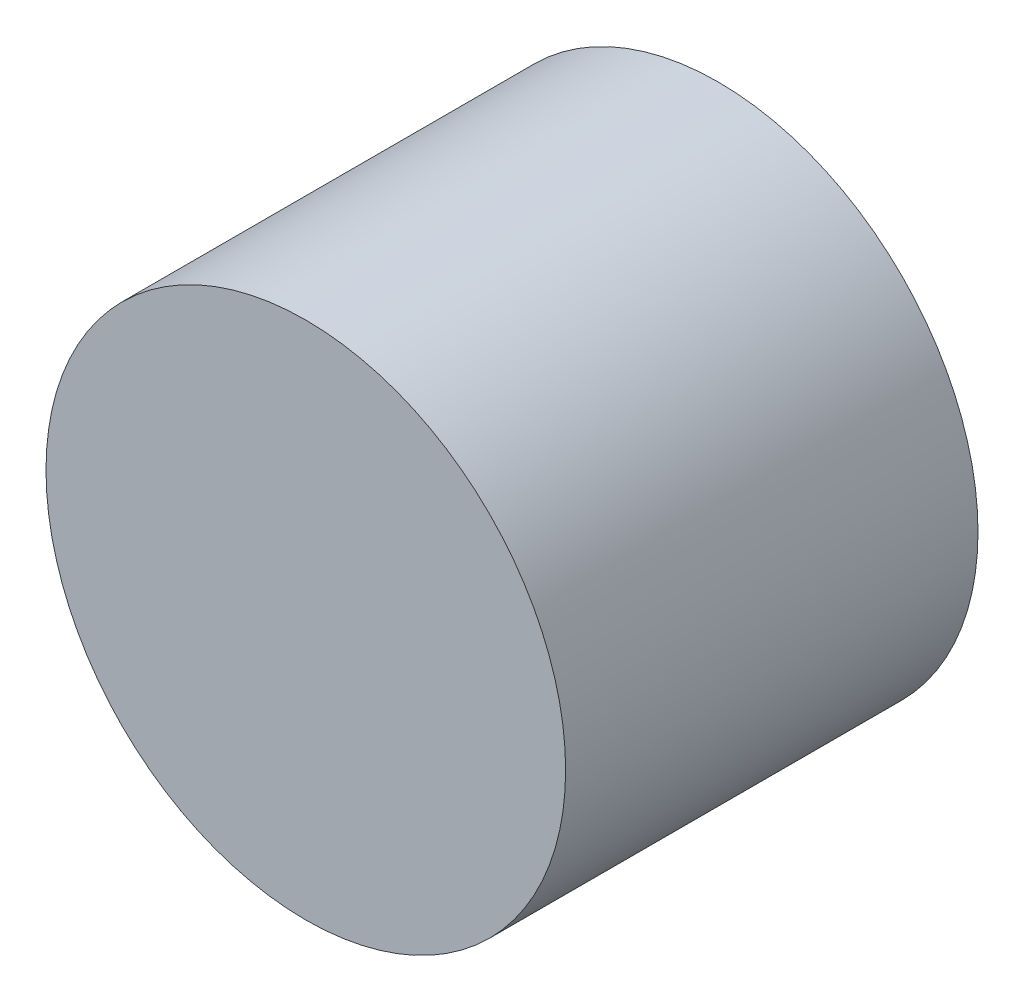
ISO-10303-21;
HEADER;
FILE_DESCRIPTION(('STEP AP214'),'2;1');
FILE_NAME('part.step','',(''),(''),'','','');
FILE_SCHEMA(('AUTOMOTIVE_DESIGN { 1 0 10303 214 1 1 1 1 }'));
ENDSEC;
DATA;
#1=APPLICATION_CONTEXT('core data for automotive mechanical design processes');
#2=APPLICATION_PROTOCOL_DEFINITION('international standard','automotive_design',2000,#1);
#3=PRODUCT_CONTEXT('',#1,'mechanical');
#4=PRODUCT('Part','Part','',(#3));
#5=PRODUCT_RELATED_PRODUCT_CATEGORY('part','',(#4));
#6=PRODUCT_DEFINITION_FORMATION('','',#4);
#7=PRODUCT_DEFINITION_CONTEXT('part definition',#1,'design');
#8=PRODUCT_DEFINITION('design','',#6,#7);
#9=PRODUCT_DEFINITION_SHAPE('','',#8);
#10=(LENGTH_UNIT() NAMED_UNIT(*) SI_UNIT(.MILLI.,.METRE.));
#11=(NAMED_UNIT(*) PLANE_ANGLE_UNIT() SI_UNIT($,.RADIAN.));
#12=(NAMED_UNIT(*) SI_UNIT($,.STERADIAN.) SOLID_ANGLE_UNIT());
#13=UNCERTAINTY_MEASURE_WITH_UNIT(LENGTH_MEASURE(1.E-05),#10,'distance_accuracy_value','');
#14=(GEOMETRIC_REPRESENTATION_CONTEXT(3) GLOBAL_UNCERTAINTY_ASSIGNED_CONTEXT((#13)) GLOBAL_UNIT_ASSIGNED_CONTEXT((#10,
#11,#12)) REPRESENTATION_CONTEXT('',''));
#15=CARTESIAN_POINT('',(0.,0.,0.));
#16=DIRECTION('',(0.,0.,1.));
#17=DIRECTION('',(1.,0.,0.));
#18=AXIS2_PLACEMENT_3D('',#15,#16,#17);
#19=CARTESIAN_POINT('',(-3.719,5.173,11.731));
#20=DIRECTION('',(0.,0.,-1.));
#21=DIRECTION('',(-1.,0.,0.));
#22=AXIS2_PLACEMENT_3D('',#19,#20,#21);
#23=CYLINDRICAL_SURFACE('',#22,7.391);
#24=CARTESIAN_POINT('',(-3.719,5.173,11.731));
#25=DIRECTION('',(0.,0.,1.));
#26=DIRECTION('',(1.,0.,0.));
#27=AXIS2_PLACEMENT_3D('',#24,#25,#26);
#28=CIRCLE('',#27,7.391);
#29=CARTESIAN_POINT('',(3.672,5.173,11.731));
#30=VERTEX_POINT('',#29);
#31=EDGE_CURVE('E10',#30,#30,#28,.T.);
#32=ORIENTED_EDGE('',*,*,#31,.F.);
#33=EDGE_LOOP('',(#32));
#34=FACE_BOUND('',#33,.T.);
#35=CARTESIAN_POINT('',(-3.719,5.173,0.));
#36=DIRECTION('',(0.,0.,1.));
#37=DIRECTION('',(1.,0.,0.));
#38=AXIS2_PLACEMENT_3D('',#35,#36,#37);
#39=CIRCLE('',#38,7.391);
#40=CARTESIAN_POINT('',(3.672,5.173,0.));
#41=VERTEX_POINT('',#40);
#42=EDGE_CURVE('E45',#41,#41,#39,.T.);
#43=ORIENTED_EDGE('',*,*,#42,.T.);
#44=EDGE_LOOP('',(#43));
#45=FACE_BOUND('',#44,.T.);
#46=ADVANCED_FACE('F39',(#34,#45),#23,.T.);
#47=CARTESIAN_POINT('',(-3.719,5.173,11.731));
#48=DIRECTION('',(0.,0.,1.));
#49=DIRECTION('',(1.,0.,0.));
#50=AXIS2_PLACEMENT_3D('',#47,#48,#49);
#51=PLANE('',#50);
#52=ORIENTED_EDGE('',*,*,#31,.T.);
#53=EDGE_LOOP('',(#52));
#54=FACE_BOUND('',#53,.T.);
#55=ADVANCED_FACE('F53',(#54),#51,.T.);
#56=CARTESIAN_POINT('',(-3.719,5.173,0.));
#57=DIRECTION('',(0.,0.,1.));
#58=DIRECTION('',(1.,0.,0.));
#59=AXIS2_PLACEMENT_3D('',#56,#57,#58);
#60=PLANE('',#59);
#61=ORIENTED_EDGE('',*,*,#42,.F.);
#62=EDGE_LOOP('',(#61));
#63=FACE_BOUND('',#62,.T.);
#64=ADVANCED_FACE('F55',(#63),#60,.F.);
#65=CLOSED_SHELL('',(#46,#55,#64));
#66=MANIFOLD_SOLID_BREP('B2',#65);
#67=ADVANCED_BREP_SHAPE_REPRESENTATION('',(#18,#66),#14);
#68=SHAPE_DEFINITION_REPRESENTATION(#9,#67);
ENDSEC;
END-ISO-10303-21;
